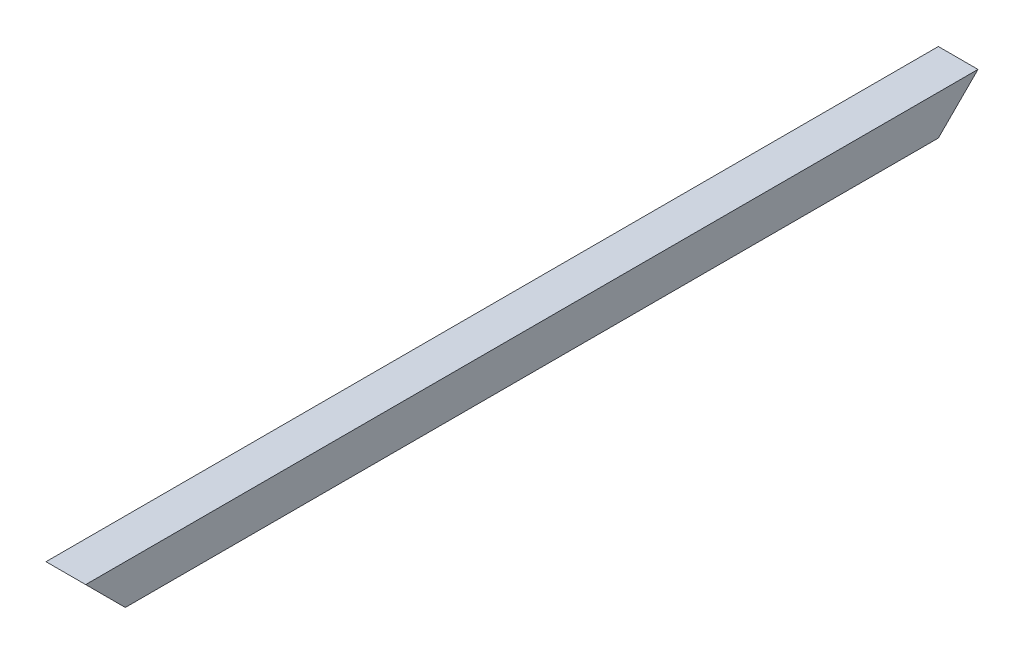
ISO-10303-21;
HEADER;
FILE_DESCRIPTION(('STEP AP214'),'2;1');
FILE_NAME('part.step','',(''),(''),'','','');
FILE_SCHEMA(('AUTOMOTIVE_DESIGN { 1 0 10303 214 1 1 1 1 }'));
ENDSEC;
DATA;
#1=APPLICATION_CONTEXT('core data for automotive mechanical design processes');
#2=APPLICATION_PROTOCOL_DEFINITION('international standard','automotive_design',2000,#1);
#3=PRODUCT_CONTEXT('',#1,'mechanical');
#4=PRODUCT('Part','Part','',(#3));
#5=PRODUCT_RELATED_PRODUCT_CATEGORY('part','',(#4));
#6=PRODUCT_DEFINITION_FORMATION('','',#4);
#7=PRODUCT_DEFINITION_CONTEXT('part definition',#1,'design');
#8=PRODUCT_DEFINITION('design','',#6,#7);
#9=PRODUCT_DEFINITION_SHAPE('','',#8);
#10=(LENGTH_UNIT() NAMED_UNIT(*) SI_UNIT(.MILLI.,.METRE.));
#11=(NAMED_UNIT(*) PLANE_ANGLE_UNIT() SI_UNIT($,.RADIAN.));
#12=(NAMED_UNIT(*) SI_UNIT($,.STERADIAN.) SOLID_ANGLE_UNIT());
#13=UNCERTAINTY_MEASURE_WITH_UNIT(LENGTH_MEASURE(1.E-05),#10,'distance_accuracy_value','');
#14=(GEOMETRIC_REPRESENTATION_CONTEXT(3) GLOBAL_UNCERTAINTY_ASSIGNED_CONTEXT((#13)) GLOBAL_UNIT_ASSIGNED_CONTEXT((#10,
#11,#12)) REPRESENTATION_CONTEXT('',''));
#15=CARTESIAN_POINT('',(0.,0.,0.));
#16=DIRECTION('',(0.,0.,1.));
#17=DIRECTION('',(1.,0.,0.));
#18=AXIS2_PLACEMENT_3D('',#15,#16,#17);
#19=CARTESIAN_POINT('',(-50.,-50.,1125.));
#20=DIRECTION('',(1.,0.,0.));
#21=DIRECTION('',(0.,0.,-1.));
#22=AXIS2_PLACEMENT_3D('',#19,#20,#21);
#23=PLANE('',#22);
#24=DIRECTION('',(0.,-0.707106781186555,0.70710678118654));
#25=VECTOR('',#24,1.);
#26=CARTESIAN_POINT('',(-50.,49.9999999999999,-1125.));
#27=LINE('',#26,#25);
#28=CARTESIAN_POINT('',(-50.,49.9999999999999,-1125.));
#29=VERTEX_POINT('',#28);
#30=CARTESIAN_POINT('',(-50.,-50.,-1025.));
#31=VERTEX_POINT('',#30);
#32=EDGE_CURVE('E97',#29,#31,#27,.T.);
#33=ORIENTED_EDGE('',*,*,#32,.T.);
#34=DIRECTION('',(0.,0.,-1.));
#35=VECTOR('',#34,1.);
#36=CARTESIAN_POINT('',(-50.,-50.,1125.));
#37=LINE('',#36,#35);
#38=CARTESIAN_POINT('',(-50.,-50.,1025.));
#39=VERTEX_POINT('',#38);
#40=EDGE_CURVE('E39',#39,#31,#37,.T.);
#41=ORIENTED_EDGE('',*,*,#40,.F.);
#42=DIRECTION('',(0.,0.707106781186539,0.707106781186556));
#43=VECTOR('',#42,1.);
#44=CARTESIAN_POINT('',(-50.,49.9999999999999,1125.));
#45=LINE('',#44,#43);
#46=CARTESIAN_POINT('',(-50.,49.9999999999999,1125.));
#47=VERTEX_POINT('',#46);
#48=EDGE_CURVE('E150',#39,#47,#45,.T.);
#49=ORIENTED_EDGE('',*,*,#48,.T.);
#50=DIRECTION('',(0.,0.,-1.));
#51=VECTOR('',#50,1.);
#52=CARTESIAN_POINT('',(-50.,49.9999999999999,1125.));
#53=LINE('',#52,#51);
#54=EDGE_CURVE('E112',#47,#29,#53,.T.);
#55=ORIENTED_EDGE('',*,*,#54,.T.);
#56=EDGE_LOOP('',(#33,#41,#49,#55));
#57=FACE_BOUND('',#56,.T.);
#58=ADVANCED_FACE('F32',(#57),#23,.F.);
#59=CARTESIAN_POINT('',(-50.,-50.,1125.));
#60=DIRECTION('',(0.,1.,0.));
#61=DIRECTION('',(0.,0.,1.));
#62=AXIS2_PLACEMENT_3D('',#59,#60,#61);
#63=PLANE('',#62);
#64=DIRECTION('',(-1.,0.,0.));
#65=VECTOR('',#64,1.);
#66=CARTESIAN_POINT('',(50.,-50.,-1025.));
#67=LINE('',#66,#65);
#68=CARTESIAN_POINT('',(50.,-50.,-1025.));
#69=VERTEX_POINT('',#68);
#70=EDGE_CURVE('E94',#69,#31,#67,.T.);
#71=ORIENTED_EDGE('',*,*,#70,.F.);
#72=DIRECTION('',(0.,0.,-1.));
#73=VECTOR('',#72,1.);
#74=CARTESIAN_POINT('',(50.,-50.,1125.));
#75=LINE('',#74,#73);
#76=CARTESIAN_POINT('',(50.,-50.,1025.));
#77=VERTEX_POINT('',#76);
#78=EDGE_CURVE('E117',#77,#69,#75,.T.);
#79=ORIENTED_EDGE('',*,*,#78,.F.);
#80=DIRECTION('',(-1.,0.,0.));
#81=VECTOR('',#80,1.);
#82=CARTESIAN_POINT('',(50.,-50.,1025.));
#83=LINE('',#82,#81);
#84=EDGE_CURVE('E116',#77,#39,#83,.T.);
#85=ORIENTED_EDGE('',*,*,#84,.T.);
#86=ORIENTED_EDGE('',*,*,#40,.T.);
#87=EDGE_LOOP('',(#71,#79,#85,#86));
#88=FACE_BOUND('',#87,.T.);
#89=ADVANCED_FACE('F115',(#88),#63,.F.);
#90=CARTESIAN_POINT('',(50.,-50.,1125.));
#91=DIRECTION('',(-1.,0.,0.));
#92=DIRECTION('',(0.,-1.,0.));
#93=AXIS2_PLACEMENT_3D('',#90,#91,#92);
#94=PLANE('',#93);
#95=DIRECTION('',(0.,-0.707106781186555,0.70710678118654));
#96=VECTOR('',#95,1.);
#97=CARTESIAN_POINT('',(50.,49.9999999999999,-1125.));
#98=LINE('',#97,#96);
#99=CARTESIAN_POINT('',(50.,49.9999999999999,-1125.));
#100=VERTEX_POINT('',#99);
#101=EDGE_CURVE('E100',#100,#69,#98,.T.);
#102=ORIENTED_EDGE('',*,*,#101,.F.);
#103=DIRECTION('',(0.,0.,-1.));
#104=VECTOR('',#103,1.);
#105=CARTESIAN_POINT('',(49.9999999999999,49.9999999999999,1125.));
#106=LINE('',#105,#104);
#107=CARTESIAN_POINT('',(49.9999999999999,49.9999999999999,1125.));
#108=VERTEX_POINT('',#107);
#109=EDGE_CURVE('E118',#108,#100,#106,.T.);
#110=ORIENTED_EDGE('',*,*,#109,.F.);
#111=DIRECTION('',(0.,0.707106781186539,0.707106781186556));
#112=VECTOR('',#111,1.);
#113=CARTESIAN_POINT('',(50.,49.9999999999999,1125.));
#114=LINE('',#113,#112);
#115=EDGE_CURVE('E148',#77,#108,#114,.T.);
#116=ORIENTED_EDGE('',*,*,#115,.F.);
#117=ORIENTED_EDGE('',*,*,#78,.T.);
#118=EDGE_LOOP('',(#102,#110,#116,#117));
#119=FACE_BOUND('',#118,.T.);
#120=ADVANCED_FACE('F185',(#119),#94,.F.);
#121=CARTESIAN_POINT('',(-45.,-45.,1125.));
#122=DIRECTION('',(1.,0.,0.));
#123=DIRECTION('',(0.,0.,-1.));
#124=AXIS2_PLACEMENT_3D('',#121,#122,#123);
#125=PLANE('',#124);
#126=DIRECTION('',(0.,0.,-1.));
#127=VECTOR('',#126,1.);
#128=CARTESIAN_POINT('',(-45.,-45.,1125.));
#129=LINE('',#128,#127);
#130=CARTESIAN_POINT('',(-45.,-45.,1030.));
#131=VERTEX_POINT('',#130);
#132=CARTESIAN_POINT('',(-45.,-45.,-1030.));
#133=VERTEX_POINT('',#132);
#134=EDGE_CURVE('E127',#131,#133,#129,.T.);
#135=ORIENTED_EDGE('',*,*,#134,.T.);
#136=DIRECTION('',(0.,0.707106781186555,-0.70710678118654));
#137=VECTOR('',#136,1.);
#138=CARTESIAN_POINT('',(-45.,-1122.5,47.4999999999761));
#139=LINE('',#138,#137);
#140=CARTESIAN_POINT('',(-45.,44.9999999999999,-1120.));
#141=VERTEX_POINT('',#140);
#142=EDGE_CURVE('E152',#133,#141,#139,.T.);
#143=ORIENTED_EDGE('',*,*,#142,.T.);
#144=DIRECTION('',(0.,0.,-1.));
#145=VECTOR('',#144,1.);
#146=CARTESIAN_POINT('',(-45.,44.9999999999999,1125.));
#147=LINE('',#146,#145);
#148=CARTESIAN_POINT('',(-45.,44.9999999999999,1120.));
#149=VERTEX_POINT('',#148);
#150=EDGE_CURVE('E137',#149,#141,#147,.T.);
#151=ORIENTED_EDGE('',*,*,#150,.F.);
#152=DIRECTION('',(0.,-0.707106781186539,-0.707106781186556));
#153=VECTOR('',#152,1.);
#154=CARTESIAN_POINT('',(-45.,2.50000000000105,1077.5));
#155=LINE('',#154,#153);
#156=EDGE_CURVE('E54',#149,#131,#155,.T.);
#157=ORIENTED_EDGE('',*,*,#156,.T.);
#158=EDGE_LOOP('',(#135,#143,#151,#157));
#159=FACE_BOUND('',#158,.T.);
#160=ADVANCED_FACE('F173',(#159),#125,.T.);
#161=CARTESIAN_POINT('',(-45.,-45.,1125.));
#162=DIRECTION('',(0.,1.,0.));
#163=DIRECTION('',(0.,0.,1.));
#164=AXIS2_PLACEMENT_3D('',#161,#162,#163);
#165=PLANE('',#164);
#166=DIRECTION('',(0.,0.,-1.));
#167=VECTOR('',#166,1.);
#168=CARTESIAN_POINT('',(45.,-45.,1125.));
#169=LINE('',#168,#167);
#170=CARTESIAN_POINT('',(45.,-45.,1030.));
#171=VERTEX_POINT('',#170);
#172=CARTESIAN_POINT('',(45.,-44.9999999999999,-1030.));
#173=VERTEX_POINT('',#172);
#174=EDGE_CURVE('E131',#171,#173,#169,.T.);
#175=ORIENTED_EDGE('',*,*,#174,.T.);
#176=DIRECTION('',(-1.,0.,0.));
#177=VECTOR('',#176,1.);
#178=CARTESIAN_POINT('',(-45.,-45.,-1030.));
#179=LINE('',#178,#177);
#180=EDGE_CURVE('E155',#173,#133,#179,.T.);
#181=ORIENTED_EDGE('',*,*,#180,.T.);
#182=ORIENTED_EDGE('',*,*,#134,.F.);
#183=DIRECTION('',(1.,0.,0.));
#184=VECTOR('',#183,1.);
#185=CARTESIAN_POINT('',(-45.,-45.,1030.));
#186=LINE('',#185,#184);
#187=EDGE_CURVE('E141',#131,#171,#186,.T.);
#188=ORIENTED_EDGE('',*,*,#187,.T.);
#189=EDGE_LOOP('',(#175,#181,#182,#188));
#190=FACE_BOUND('',#189,.T.);
#191=ADVANCED_FACE('F171',(#190),#165,.T.);
#192=CARTESIAN_POINT('',(45.,-45.,1125.));
#193=DIRECTION('',(-1.,0.,0.));
#194=DIRECTION('',(0.,-1.,0.));
#195=AXIS2_PLACEMENT_3D('',#192,#193,#194);
#196=PLANE('',#195);
#197=DIRECTION('',(0.,0.,-1.));
#198=VECTOR('',#197,1.);
#199=CARTESIAN_POINT('',(45.,44.9999999999999,1125.));
#200=LINE('',#199,#198);
#201=CARTESIAN_POINT('',(45.,44.9999999999999,1120.));
#202=VERTEX_POINT('',#201);
#203=CARTESIAN_POINT('',(45.,44.9999999999999,-1120.));
#204=VERTEX_POINT('',#203);
#205=EDGE_CURVE('E134',#202,#204,#200,.T.);
#206=ORIENTED_EDGE('',*,*,#205,.T.);
#207=DIRECTION('',(0.,-0.707106781186555,0.70710678118654));
#208=VECTOR('',#207,1.);
#209=CARTESIAN_POINT('',(45.0000000000007,-1122.5,47.4999999999761));
#210=LINE('',#209,#208);
#211=EDGE_CURVE('E46',#204,#173,#210,.T.);
#212=ORIENTED_EDGE('',*,*,#211,.T.);
#213=ORIENTED_EDGE('',*,*,#174,.F.);
#214=DIRECTION('',(0.,0.707106781186539,0.707106781186556));
#215=VECTOR('',#214,1.);
#216=CARTESIAN_POINT('',(45.,2.50000000000105,1077.5));
#217=LINE('',#216,#215);
#218=EDGE_CURVE('E144',#171,#202,#217,.T.);
#219=ORIENTED_EDGE('',*,*,#218,.T.);
#220=EDGE_LOOP('',(#206,#212,#213,#219));
#221=FACE_BOUND('',#220,.T.);
#222=ADVANCED_FACE('F165',(#221),#196,.T.);
#223=CARTESIAN_POINT('',(-45.,44.9999999999999,1125.));
#224=DIRECTION('',(0.,-1.,0.));
#225=DIRECTION('',(0.,0.,-1.));
#226=AXIS2_PLACEMENT_3D('',#223,#224,#225);
#227=PLANE('',#226);
#228=ORIENTED_EDGE('',*,*,#150,.T.);
#229=DIRECTION('',(1.,0.,0.));
#230=VECTOR('',#229,1.);
#231=CARTESIAN_POINT('',(-45.,44.9999999999999,-1120.));
#232=LINE('',#231,#230);
#233=EDGE_CURVE('E105',#141,#204,#232,.T.);
#234=ORIENTED_EDGE('',*,*,#233,.T.);
#235=ORIENTED_EDGE('',*,*,#205,.F.);
#236=DIRECTION('',(-1.,0.,0.));
#237=VECTOR('',#236,1.);
#238=CARTESIAN_POINT('',(-45.,44.9999999999999,1120.));
#239=LINE('',#238,#237);
#240=EDGE_CURVE('E11',#202,#149,#239,.T.);
#241=ORIENTED_EDGE('',*,*,#240,.T.);
#242=EDGE_LOOP('',(#228,#234,#235,#241));
#243=FACE_BOUND('',#242,.T.);
#244=ADVANCED_FACE('F162',(#243),#227,.T.);
#245=CARTESIAN_POINT('',(-50.,49.9999999999999,1125.));
#246=DIRECTION('',(0.,-1.,0.));
#247=DIRECTION('',(0.,0.,-1.));
#248=AXIS2_PLACEMENT_3D('',#245,#246,#247);
#249=PLANE('',#248);
#250=DIRECTION('',(-1.,0.,0.));
#251=VECTOR('',#250,1.);
#252=CARTESIAN_POINT('',(-50.,49.9999999999999,-1125.));
#253=LINE('',#252,#251);
#254=EDGE_CURVE('E125',#100,#29,#253,.T.);
#255=ORIENTED_EDGE('',*,*,#254,.T.);
#256=ORIENTED_EDGE('',*,*,#54,.F.);
#257=DIRECTION('',(-1.,0.,0.));
#258=VECTOR('',#257,1.);
#259=CARTESIAN_POINT('',(-50.,49.9999999999999,1125.));
#260=LINE('',#259,#258);
#261=EDGE_CURVE('E124',#108,#47,#260,.T.);
#262=ORIENTED_EDGE('',*,*,#261,.F.);
#263=ORIENTED_EDGE('',*,*,#109,.T.);
#264=EDGE_LOOP('',(#255,#256,#262,#263));
#265=FACE_BOUND('',#264,.T.);
#266=ADVANCED_FACE('F179',(#265),#249,.F.);
#267=CARTESIAN_POINT('',(50.,49.9999999999999,1125.));
#268=DIRECTION('',(0.,-0.707106781186556,0.707106781186539));
#269=DIRECTION('',(0.,-0.707106781186539,-0.707106781186556));
#270=AXIS2_PLACEMENT_3D('',#267,#268,#269);
#271=PLANE('',#270);
#272=ORIENTED_EDGE('',*,*,#240,.F.);
#273=ORIENTED_EDGE('',*,*,#218,.F.);
#274=ORIENTED_EDGE('',*,*,#187,.F.);
#275=ORIENTED_EDGE('',*,*,#156,.F.);
#276=EDGE_LOOP('',(#272,#273,#274,#275));
#277=FACE_BOUND('',#276,.T.);
#278=ORIENTED_EDGE('',*,*,#84,.F.);
#279=ORIENTED_EDGE('',*,*,#115,.T.);
#280=ORIENTED_EDGE('',*,*,#261,.T.);
#281=ORIENTED_EDGE('',*,*,#48,.F.);
#282=EDGE_LOOP('',(#278,#279,#280,#281));
#283=FACE_BOUND('',#282,.T.);
#284=ADVANCED_FACE('F167',(#277,#283),#271,.T.);
#285=CARTESIAN_POINT('',(50.,49.9999999999999,-1125.));
#286=DIRECTION('',(0.,-0.70710678118654,-0.707106781186555));
#287=DIRECTION('',(0.,0.707106781186555,-0.70710678118654));
#288=AXIS2_PLACEMENT_3D('',#285,#286,#287);
#289=PLANE('',#288);
#290=ORIENTED_EDGE('',*,*,#180,.F.);
#291=ORIENTED_EDGE('',*,*,#211,.F.);
#292=ORIENTED_EDGE('',*,*,#233,.F.);
#293=ORIENTED_EDGE('',*,*,#142,.F.);
#294=EDGE_LOOP('',(#290,#291,#292,#293));
#295=FACE_BOUND('',#294,.T.);
#296=ORIENTED_EDGE('',*,*,#254,.F.);
#297=ORIENTED_EDGE('',*,*,#101,.T.);
#298=ORIENTED_EDGE('',*,*,#70,.T.);
#299=ORIENTED_EDGE('',*,*,#32,.F.);
#300=EDGE_LOOP('',(#296,#297,#298,#299));
#301=FACE_BOUND('',#300,.T.);
#302=ADVANCED_FACE('F96',(#295,#301),#289,.T.);
#303=CLOSED_SHELL('',(#58,#89,#120,#160,#191,#222,#244,#266,#284,#302));
#304=MANIFOLD_SOLID_BREP('B2',#303);
#305=ADVANCED_BREP_SHAPE_REPRESENTATION('',(#18,#304),#14);
#306=SHAPE_DEFINITION_REPRESENTATION(#9,#305);
ENDSEC;
END-ISO-10303-21;
